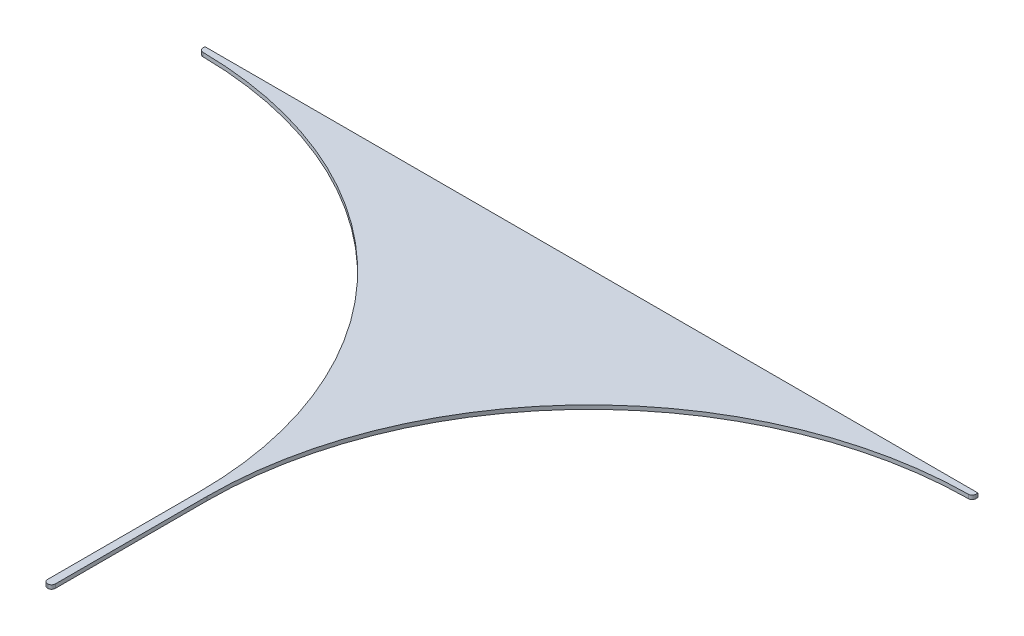
ISO-10303-21;
HEADER;
FILE_DESCRIPTION(('STEP AP214'),'2;1');
FILE_NAME('part.step','',(''),(''),'','','');
FILE_SCHEMA(('AUTOMOTIVE_DESIGN { 1 0 10303 214 1 1 1 1 }'));
ENDSEC;
DATA;
#1=APPLICATION_CONTEXT('core data for automotive mechanical design processes');
#2=APPLICATION_PROTOCOL_DEFINITION('international standard','automotive_design',2000,#1);
#3=PRODUCT_CONTEXT('',#1,'mechanical');
#4=PRODUCT('Part','Part','',(#3));
#5=PRODUCT_RELATED_PRODUCT_CATEGORY('part','',(#4));
#6=PRODUCT_DEFINITION_FORMATION('','',#4);
#7=PRODUCT_DEFINITION_CONTEXT('part definition',#1,'design');
#8=PRODUCT_DEFINITION('design','',#6,#7);
#9=PRODUCT_DEFINITION_SHAPE('','',#8);
#10=(LENGTH_UNIT() NAMED_UNIT(*) SI_UNIT(.MILLI.,.METRE.));
#11=(NAMED_UNIT(*) PLANE_ANGLE_UNIT() SI_UNIT($,.RADIAN.));
#12=(NAMED_UNIT(*) SI_UNIT($,.STERADIAN.) SOLID_ANGLE_UNIT());
#13=UNCERTAINTY_MEASURE_WITH_UNIT(LENGTH_MEASURE(1.E-05),#10,'distance_accuracy_value','');
#14=(GEOMETRIC_REPRESENTATION_CONTEXT(3) GLOBAL_UNCERTAINTY_ASSIGNED_CONTEXT((#13)) GLOBAL_UNIT_ASSIGNED_CONTEXT((#10,
#11,#12)) REPRESENTATION_CONTEXT('',''));
#15=CARTESIAN_POINT('',(0.,0.,0.));
#16=DIRECTION('',(0.,0.,1.));
#17=DIRECTION('',(1.,0.,0.));
#18=AXIS2_PLACEMENT_3D('',#15,#16,#17);
#19=CARTESIAN_POINT('',(0.,-2.,1.10907511904929));
#20=DIRECTION('',(-1.,0.,0.));
#21=DIRECTION('',(0.,0.,1.));
#22=AXIS2_PLACEMENT_3D('',#19,#20,#21);
#23=PLANE('',#22);
#24=DIRECTION('',(0.,0.,1.));
#25=VECTOR('',#24,1.);
#26=CARTESIAN_POINT('',(0.,0.,1.10907511904929));
#27=LINE('',#26,#25);
#28=CARTESIAN_POINT('',(0.,0.,0.));
#29=VERTEX_POINT('',#28);
#30=CARTESIAN_POINT('',(0.,0.,1.10907511904928));
#31=VERTEX_POINT('',#30);
#32=EDGE_CURVE('E157',#29,#31,#27,.T.);
#33=ORIENTED_EDGE('',*,*,#32,.F.);
#34=DIRECTION('',(0.,1.,0.));
#35=VECTOR('',#34,1.);
#36=CARTESIAN_POINT('',(0.,-2.,0.));
#37=LINE('',#36,#35);
#38=CARTESIAN_POINT('',(0.,-2.,0.));
#39=VERTEX_POINT('',#38);
#40=EDGE_CURVE('E11',#39,#29,#37,.T.);
#41=ORIENTED_EDGE('',*,*,#40,.F.);
#42=DIRECTION('',(0.,0.,1.));
#43=VECTOR('',#42,1.);
#44=CARTESIAN_POINT('',(0.,-2.,1.10907511904929));
#45=LINE('',#44,#43);
#46=CARTESIAN_POINT('',(0.,-2.,1.10907511904928));
#47=VERTEX_POINT('',#46);
#48=EDGE_CURVE('E189',#39,#47,#45,.T.);
#49=ORIENTED_EDGE('',*,*,#48,.T.);
#50=DIRECTION('',(0.,1.,0.));
#51=VECTOR('',#50,1.);
#52=CARTESIAN_POINT('',(0.,-2.,1.10907511904928));
#53=LINE('',#52,#51);
#54=EDGE_CURVE('E39',#47,#31,#53,.T.);
#55=ORIENTED_EDGE('',*,*,#54,.T.);
#56=EDGE_LOOP('',(#33,#41,#49,#55));
#57=FACE_BOUND('',#56,.T.);
#58=ADVANCED_FACE('F36',(#57),#23,.T.);
#59=CARTESIAN_POINT('',(0.,-2.,0.));
#60=DIRECTION('',(0.,0.,-1.));
#61=DIRECTION('',(-1.,0.,0.));
#62=AXIS2_PLACEMENT_3D('',#59,#60,#61);
#63=PLANE('',#62);
#64=DIRECTION('',(-1.,0.,0.));
#65=VECTOR('',#64,1.);
#66=CARTESIAN_POINT('',(0.,0.,0.));
#67=LINE('',#66,#65);
#68=CARTESIAN_POINT('',(398.,0.,0.));
#69=VERTEX_POINT('',#68);
#70=EDGE_CURVE('E187',#69,#29,#67,.T.);
#71=ORIENTED_EDGE('',*,*,#70,.F.);
#72=DIRECTION('',(0.,1.,0.));
#73=VECTOR('',#72,1.);
#74=CARTESIAN_POINT('',(398.,-2.,0.));
#75=LINE('',#74,#73);
#76=CARTESIAN_POINT('',(398.,-2.,0.));
#77=VERTEX_POINT('',#76);
#78=EDGE_CURVE('E45',#77,#69,#75,.T.);
#79=ORIENTED_EDGE('',*,*,#78,.F.);
#80=DIRECTION('',(-1.,0.,0.));
#81=VECTOR('',#80,1.);
#82=CARTESIAN_POINT('',(0.,-2.,0.));
#83=LINE('',#82,#81);
#84=EDGE_CURVE('E147',#77,#39,#83,.T.);
#85=ORIENTED_EDGE('',*,*,#84,.T.);
#86=ORIENTED_EDGE('',*,*,#40,.T.);
#87=EDGE_LOOP('',(#71,#79,#85,#86));
#88=FACE_BOUND('',#87,.T.);
#89=ADVANCED_FACE('F210',(#88),#63,.T.);
#90=CARTESIAN_POINT('',(398.,-2.,0.));
#91=DIRECTION('',(1.,0.,0.));
#92=DIRECTION('',(0.,0.,-1.));
#93=AXIS2_PLACEMENT_3D('',#90,#91,#92);
#94=PLANE('',#93);
#95=DIRECTION('',(0.,0.,-1.));
#96=VECTOR('',#95,1.);
#97=CARTESIAN_POINT('',(398.,0.,0.));
#98=LINE('',#97,#96);
#99=CARTESIAN_POINT('',(398.,0.,1.10907511904926));
#100=VERTEX_POINT('',#99);
#101=EDGE_CURVE('E134',#100,#69,#98,.T.);
#102=ORIENTED_EDGE('',*,*,#101,.F.);
#103=DIRECTION('',(0.,1.,0.));
#104=VECTOR('',#103,1.);
#105=CARTESIAN_POINT('',(398.,-2.,1.10907511904926));
#106=LINE('',#105,#104);
#107=CARTESIAN_POINT('',(398.,-2.,1.10907511904926));
#108=VERTEX_POINT('',#107);
#109=EDGE_CURVE('E129',#108,#100,#106,.T.);
#110=ORIENTED_EDGE('',*,*,#109,.F.);
#111=DIRECTION('',(0.,0.,-1.));
#112=VECTOR('',#111,1.);
#113=CARTESIAN_POINT('',(398.,-2.,0.));
#114=LINE('',#113,#112);
#115=EDGE_CURVE('E132',#108,#77,#114,.T.);
#116=ORIENTED_EDGE('',*,*,#115,.T.);
#117=ORIENTED_EDGE('',*,*,#78,.T.);
#118=EDGE_LOOP('',(#102,#110,#116,#117));
#119=FACE_BOUND('',#118,.T.);
#120=ADVANCED_FACE('F131',(#119),#94,.T.);
#121=CARTESIAN_POINT('',(396.1,-2.,1.10907511904926));
#122=DIRECTION('',(0.,1.,0.));
#123=DIRECTION('',(0.,0.,1.));
#124=AXIS2_PLACEMENT_3D('',#121,#122,#123);
#125=CYLINDRICAL_SURFACE('',#124,1.90000000000002);
#126=CARTESIAN_POINT('',(396.1,0.,1.10907511904926));
#127=DIRECTION('',(0.,1.,0.));
#128=DIRECTION('',(0.,0.,1.));
#129=AXIS2_PLACEMENT_3D('',#126,#127,#128);
#130=CIRCLE('',#129,1.90000000000002);
#131=CARTESIAN_POINT('',(396.118149824032,0.,3.00898842862095));
#132=VERTEX_POINT('',#131);
#133=EDGE_CURVE('E184',#132,#100,#130,.T.);
#134=ORIENTED_EDGE('',*,*,#133,.F.);
#135=DIRECTION('',(0.,1.,0.));
#136=VECTOR('',#135,1.);
#137=CARTESIAN_POINT('',(396.118149824032,-2.,3.00898842862095));
#138=LINE('',#137,#136);
#139=CARTESIAN_POINT('',(396.118149824032,-2.,3.00898842862095));
#140=VERTEX_POINT('',#139);
#141=EDGE_CURVE('E139',#140,#132,#138,.T.);
#142=ORIENTED_EDGE('',*,*,#141,.F.);
#143=CARTESIAN_POINT('',(396.1,-2.,1.10907511904926));
#144=DIRECTION('',(0.,1.,0.));
#145=DIRECTION('',(0.,0.,1.));
#146=AXIS2_PLACEMENT_3D('',#143,#144,#145);
#147=CIRCLE('',#146,1.90000000000002);
#148=EDGE_CURVE('E145',#140,#108,#147,.T.);
#149=ORIENTED_EDGE('',*,*,#148,.T.);
#150=ORIENTED_EDGE('',*,*,#109,.T.);
#151=EDGE_LOOP('',(#134,#142,#149,#150));
#152=FACE_BOUND('',#151,.T.);
#153=ADVANCED_FACE('F149',(#152),#125,.T.);
#154=CARTESIAN_POINT('',(398.,-2.,200.));
#155=DIRECTION('',(0.,1.,0.));
#156=DIRECTION('',(0.,0.,1.));
#157=AXIS2_PLACEMENT_3D('',#154,#155,#156);
#158=CYLINDRICAL_SURFACE('',#157,197.);
#159=CARTESIAN_POINT('',(398.,0.,200.));
#160=DIRECTION('',(0.,-1.,0.));
#161=DIRECTION('',(0.,0.,1.));
#162=AXIS2_PLACEMENT_3D('',#159,#160,#161);
#163=CIRCLE('',#162,197.);
#164=CARTESIAN_POINT('',(201.,0.,200.));
#165=VERTEX_POINT('',#164);
#166=EDGE_CURVE('E181',#165,#132,#163,.T.);
#167=ORIENTED_EDGE('',*,*,#166,.F.);
#168=DIRECTION('',(0.,1.,0.));
#169=VECTOR('',#168,1.);
#170=CARTESIAN_POINT('',(201.,-2.,200.));
#171=LINE('',#170,#169);
#172=CARTESIAN_POINT('',(201.,-2.,200.));
#173=VERTEX_POINT('',#172);
#174=EDGE_CURVE('E193',#173,#165,#171,.T.);
#175=ORIENTED_EDGE('',*,*,#174,.F.);
#176=CARTESIAN_POINT('',(398.,-2.,200.));
#177=DIRECTION('',(0.,-1.,0.));
#178=DIRECTION('',(0.,0.,1.));
#179=AXIS2_PLACEMENT_3D('',#176,#177,#178);
#180=CIRCLE('',#179,197.);
#181=EDGE_CURVE('E150',#173,#140,#180,.T.);
#182=ORIENTED_EDGE('',*,*,#181,.T.);
#183=ORIENTED_EDGE('',*,*,#141,.T.);
#184=EDGE_LOOP('',(#167,#175,#182,#183));
#185=FACE_BOUND('',#184,.T.);
#186=ADVANCED_FACE('F223',(#185),#158,.F.);
#187=CARTESIAN_POINT('',(201.,-2.,278.1));
#188=DIRECTION('',(1.,0.,0.));
#189=DIRECTION('',(0.,0.,-1.));
#190=AXIS2_PLACEMENT_3D('',#187,#188,#189);
#191=PLANE('',#190);
#192=DIRECTION('',(0.,0.,-1.));
#193=VECTOR('',#192,1.);
#194=CARTESIAN_POINT('',(201.,0.,278.1));
#195=LINE('',#194,#193);
#196=CARTESIAN_POINT('',(201.,0.,278.1));
#197=VERTEX_POINT('',#196);
#198=EDGE_CURVE('E178',#197,#165,#195,.T.);
#199=ORIENTED_EDGE('',*,*,#198,.F.);
#200=DIRECTION('',(0.,1.,0.));
#201=VECTOR('',#200,1.);
#202=CARTESIAN_POINT('',(201.,-2.,278.1));
#203=LINE('',#202,#201);
#204=CARTESIAN_POINT('',(201.,-2.,278.1));
#205=VERTEX_POINT('',#204);
#206=EDGE_CURVE('E195',#205,#197,#203,.T.);
#207=ORIENTED_EDGE('',*,*,#206,.F.);
#208=DIRECTION('',(0.,0.,-1.));
#209=VECTOR('',#208,1.);
#210=CARTESIAN_POINT('',(201.,-2.,278.1));
#211=LINE('',#210,#209);
#212=EDGE_CURVE('E152',#205,#173,#211,.T.);
#213=ORIENTED_EDGE('',*,*,#212,.T.);
#214=ORIENTED_EDGE('',*,*,#174,.T.);
#215=EDGE_LOOP('',(#199,#207,#213,#214));
#216=FACE_BOUND('',#215,.T.);
#217=ADVANCED_FACE('F226',(#216),#191,.T.);
#218=CARTESIAN_POINT('',(199.1,-2.,278.1));
#219=DIRECTION('',(0.,1.,0.));
#220=DIRECTION('',(0.,0.,1.));
#221=AXIS2_PLACEMENT_3D('',#218,#219,#220);
#222=CYLINDRICAL_SURFACE('',#221,1.90000000000001);
#223=CARTESIAN_POINT('',(199.1,0.,278.1));
#224=DIRECTION('',(0.,1.,0.));
#225=DIRECTION('',(0.,0.,1.));
#226=AXIS2_PLACEMENT_3D('',#223,#224,#225);
#227=CIRCLE('',#226,1.90000000000001);
#228=CARTESIAN_POINT('',(199.1,0.,280.));
#229=VERTEX_POINT('',#228);
#230=EDGE_CURVE('E175',#229,#197,#227,.T.);
#231=ORIENTED_EDGE('',*,*,#230,.F.);
#232=DIRECTION('',(0.,1.,0.));
#233=VECTOR('',#232,1.);
#234=CARTESIAN_POINT('',(199.1,-2.,280.));
#235=LINE('',#234,#233);
#236=CARTESIAN_POINT('',(199.1,-2.,280.));
#237=VERTEX_POINT('',#236);
#238=EDGE_CURVE('E197',#237,#229,#235,.T.);
#239=ORIENTED_EDGE('',*,*,#238,.F.);
#240=CARTESIAN_POINT('',(199.1,-2.,278.1));
#241=DIRECTION('',(0.,1.,0.));
#242=DIRECTION('',(0.,0.,1.));
#243=AXIS2_PLACEMENT_3D('',#240,#241,#242);
#244=CIRCLE('',#243,1.90000000000001);
#245=EDGE_CURVE('E382',#237,#205,#244,.T.);
#246=ORIENTED_EDGE('',*,*,#245,.T.);
#247=ORIENTED_EDGE('',*,*,#206,.T.);
#248=EDGE_LOOP('',(#231,#239,#246,#247));
#249=FACE_BOUND('',#248,.T.);
#250=ADVANCED_FACE('F230',(#249),#222,.T.);
#251=CARTESIAN_POINT('',(199.,-2.,280.));
#252=DIRECTION('',(0.,0.,1.));
#253=DIRECTION('',(1.,0.,0.));
#254=AXIS2_PLACEMENT_3D('',#251,#252,#253);
#255=PLANE('',#254);
#256=DIRECTION('',(1.,0.,0.));
#257=VECTOR('',#256,1.);
#258=CARTESIAN_POINT('',(199.,0.,280.));
#259=LINE('',#258,#257);
#260=CARTESIAN_POINT('',(198.9,0.,280.));
#261=VERTEX_POINT('',#260);
#262=EDGE_CURVE('E172',#261,#229,#259,.T.);
#263=ORIENTED_EDGE('',*,*,#262,.F.);
#264=DIRECTION('',(0.,1.,0.));
#265=VECTOR('',#264,1.);
#266=CARTESIAN_POINT('',(198.9,-2.,280.));
#267=LINE('',#266,#265);
#268=CARTESIAN_POINT('',(198.9,-2.,280.));
#269=VERTEX_POINT('',#268);
#270=EDGE_CURVE('E199',#269,#261,#267,.T.);
#271=ORIENTED_EDGE('',*,*,#270,.F.);
#272=DIRECTION('',(1.,0.,0.));
#273=VECTOR('',#272,1.);
#274=CARTESIAN_POINT('',(199.,-2.,280.));
#275=LINE('',#274,#273);
#276=EDGE_CURVE('E377',#269,#237,#275,.T.);
#277=ORIENTED_EDGE('',*,*,#276,.T.);
#278=ORIENTED_EDGE('',*,*,#238,.T.);
#279=EDGE_LOOP('',(#263,#271,#277,#278));
#280=FACE_BOUND('',#279,.T.);
#281=ADVANCED_FACE('F234',(#280),#255,.T.);
#282=CARTESIAN_POINT('',(198.9,-2.,278.1));
#283=DIRECTION('',(0.,1.,0.));
#284=DIRECTION('',(0.,0.,1.));
#285=AXIS2_PLACEMENT_3D('',#282,#283,#284);
#286=CYLINDRICAL_SURFACE('',#285,1.90000000000001);
#287=CARTESIAN_POINT('',(198.9,0.,278.1));
#288=DIRECTION('',(0.,1.,0.));
#289=DIRECTION('',(0.,0.,1.));
#290=AXIS2_PLACEMENT_3D('',#287,#288,#289);
#291=CIRCLE('',#290,1.90000000000001);
#292=CARTESIAN_POINT('',(197.,0.,278.1));
#293=VERTEX_POINT('',#292);
#294=EDGE_CURVE('E169',#293,#261,#291,.T.);
#295=ORIENTED_EDGE('',*,*,#294,.F.);
#296=DIRECTION('',(0.,1.,0.));
#297=VECTOR('',#296,1.);
#298=CARTESIAN_POINT('',(197.,-2.,278.1));
#299=LINE('',#298,#297);
#300=CARTESIAN_POINT('',(197.,-2.,278.1));
#301=VERTEX_POINT('',#300);
#302=EDGE_CURVE('E202',#301,#293,#299,.T.);
#303=ORIENTED_EDGE('',*,*,#302,.F.);
#304=CARTESIAN_POINT('',(198.9,-2.,278.1));
#305=DIRECTION('',(0.,1.,0.));
#306=DIRECTION('',(0.,0.,1.));
#307=AXIS2_PLACEMENT_3D('',#304,#305,#306);
#308=CIRCLE('',#307,1.90000000000001);
#309=EDGE_CURVE('E375',#301,#269,#308,.T.);
#310=ORIENTED_EDGE('',*,*,#309,.T.);
#311=ORIENTED_EDGE('',*,*,#270,.T.);
#312=EDGE_LOOP('',(#295,#303,#310,#311));
#313=FACE_BOUND('',#312,.T.);
#314=ADVANCED_FACE('F238',(#313),#286,.T.);
#315=CARTESIAN_POINT('',(197.,-2.,278.1));
#316=DIRECTION('',(-1.,0.,0.));
#317=DIRECTION('',(0.,0.,1.));
#318=AXIS2_PLACEMENT_3D('',#315,#316,#317);
#319=PLANE('',#318);
#320=DIRECTION('',(0.,0.,1.));
#321=VECTOR('',#320,1.);
#322=CARTESIAN_POINT('',(197.,0.,278.1));
#323=LINE('',#322,#321);
#324=CARTESIAN_POINT('',(197.,0.,200.));
#325=VERTEX_POINT('',#324);
#326=EDGE_CURVE('E166',#325,#293,#323,.T.);
#327=ORIENTED_EDGE('',*,*,#326,.F.);
#328=DIRECTION('',(0.,1.,0.));
#329=VECTOR('',#328,1.);
#330=CARTESIAN_POINT('',(197.,-2.,200.));
#331=LINE('',#330,#329);
#332=CARTESIAN_POINT('',(197.,-2.,200.));
#333=VERTEX_POINT('',#332);
#334=EDGE_CURVE('E204',#333,#325,#331,.T.);
#335=ORIENTED_EDGE('',*,*,#334,.F.);
#336=DIRECTION('',(0.,0.,1.));
#337=VECTOR('',#336,1.);
#338=CARTESIAN_POINT('',(197.,-2.,278.1));
#339=LINE('',#338,#337);
#340=EDGE_CURVE('E372',#333,#301,#339,.T.);
#341=ORIENTED_EDGE('',*,*,#340,.T.);
#342=ORIENTED_EDGE('',*,*,#302,.T.);
#343=EDGE_LOOP('',(#327,#335,#341,#342));
#344=FACE_BOUND('',#343,.T.);
#345=ADVANCED_FACE('F242',(#344),#319,.T.);
#346=CARTESIAN_POINT('',(0.,-2.,200.));
#347=DIRECTION('',(0.,1.,0.));
#348=DIRECTION('',(0.,0.,1.));
#349=AXIS2_PLACEMENT_3D('',#346,#347,#348);
#350=CYLINDRICAL_SURFACE('',#349,197.);
#351=CARTESIAN_POINT('',(0.,0.,200.));
#352=DIRECTION('',(0.,-1.,0.));
#353=DIRECTION('',(0.,0.,1.));
#354=AXIS2_PLACEMENT_3D('',#351,#352,#353);
#355=CIRCLE('',#354,197.);
#356=CARTESIAN_POINT('',(1.88185017596787,0.,3.00898842862093));
#357=VERTEX_POINT('',#356);
#358=EDGE_CURVE('E163',#357,#325,#355,.T.);
#359=ORIENTED_EDGE('',*,*,#358,.F.);
#360=DIRECTION('',(0.,1.,0.));
#361=VECTOR('',#360,1.);
#362=CARTESIAN_POINT('',(1.88185017596787,-2.,3.00898842862093));
#363=LINE('',#362,#361);
#364=CARTESIAN_POINT('',(1.88185017596787,-2.,3.00898842862093));
#365=VERTEX_POINT('',#364);
#366=EDGE_CURVE('E205',#365,#357,#363,.T.);
#367=ORIENTED_EDGE('',*,*,#366,.F.);
#368=CARTESIAN_POINT('',(0.,-2.,200.));
#369=DIRECTION('',(0.,-1.,0.));
#370=DIRECTION('',(0.,0.,1.));
#371=AXIS2_PLACEMENT_3D('',#368,#369,#370);
#372=CIRCLE('',#371,197.);
#373=EDGE_CURVE('E392',#365,#333,#372,.T.);
#374=ORIENTED_EDGE('',*,*,#373,.T.);
#375=ORIENTED_EDGE('',*,*,#334,.T.);
#376=EDGE_LOOP('',(#359,#367,#374,#375));
#377=FACE_BOUND('',#376,.T.);
#378=ADVANCED_FACE('F246',(#377),#350,.F.);
#379=CARTESIAN_POINT('',(1.90000000000001,-2.,1.10907511904927));
#380=DIRECTION('',(0.,1.,0.));
#381=DIRECTION('',(0.,0.,1.));
#382=AXIS2_PLACEMENT_3D('',#379,#380,#381);
#383=CYLINDRICAL_SURFACE('',#382,1.9);
#384=CARTESIAN_POINT('',(1.90000000000001,0.,1.10907511904927));
#385=DIRECTION('',(0.,1.,0.));
#386=DIRECTION('',(0.,0.,1.));
#387=AXIS2_PLACEMENT_3D('',#384,#385,#386);
#388=CIRCLE('',#387,1.9);
#389=EDGE_CURVE('E160',#31,#357,#388,.T.);
#390=ORIENTED_EDGE('',*,*,#389,.F.);
#391=ORIENTED_EDGE('',*,*,#54,.F.);
#392=CARTESIAN_POINT('',(1.90000000000001,-2.,1.10907511904927));
#393=DIRECTION('',(0.,1.,0.));
#394=DIRECTION('',(0.,0.,1.));
#395=AXIS2_PLACEMENT_3D('',#392,#393,#394);
#396=CIRCLE('',#395,1.9);
#397=EDGE_CURVE('E394',#47,#365,#396,.T.);
#398=ORIENTED_EDGE('',*,*,#397,.T.);
#399=ORIENTED_EDGE('',*,*,#366,.T.);
#400=EDGE_LOOP('',(#390,#391,#398,#399));
#401=FACE_BOUND('',#400,.T.);
#402=ADVANCED_FACE('F207',(#401),#383,.T.);
#403=CARTESIAN_POINT('',(396.1,-2.,1.10907511904926));
#404=DIRECTION('',(0.,1.,0.));
#405=DIRECTION('',(0.,0.,1.));
#406=AXIS2_PLACEMENT_3D('',#403,#404,#405);
#407=PLANE('',#406);
#408=ORIENTED_EDGE('',*,*,#48,.F.);
#409=ORIENTED_EDGE('',*,*,#84,.F.);
#410=ORIENTED_EDGE('',*,*,#115,.F.);
#411=ORIENTED_EDGE('',*,*,#148,.F.);
#412=ORIENTED_EDGE('',*,*,#181,.F.);
#413=ORIENTED_EDGE('',*,*,#212,.F.);
#414=ORIENTED_EDGE('',*,*,#245,.F.);
#415=ORIENTED_EDGE('',*,*,#276,.F.);
#416=ORIENTED_EDGE('',*,*,#309,.F.);
#417=ORIENTED_EDGE('',*,*,#340,.F.);
#418=ORIENTED_EDGE('',*,*,#373,.F.);
#419=ORIENTED_EDGE('',*,*,#397,.F.);
#420=EDGE_LOOP('',(#408,#409,#410,#411,#412,#413,#414,#415,#416,#417,#418,#419));
#421=FACE_BOUND('',#420,.T.);
#422=ADVANCED_FACE('F143',(#421),#407,.F.);
#423=CARTESIAN_POINT('',(396.1,0.,1.10907511904926));
#424=DIRECTION('',(0.,1.,0.));
#425=DIRECTION('',(0.,0.,1.));
#426=AXIS2_PLACEMENT_3D('',#423,#424,#425);
#427=PLANE('',#426);
#428=ORIENTED_EDGE('',*,*,#32,.T.);
#429=ORIENTED_EDGE('',*,*,#389,.T.);
#430=ORIENTED_EDGE('',*,*,#358,.T.);
#431=ORIENTED_EDGE('',*,*,#326,.T.);
#432=ORIENTED_EDGE('',*,*,#294,.T.);
#433=ORIENTED_EDGE('',*,*,#262,.T.);
#434=ORIENTED_EDGE('',*,*,#230,.T.);
#435=ORIENTED_EDGE('',*,*,#198,.T.);
#436=ORIENTED_EDGE('',*,*,#166,.T.);
#437=ORIENTED_EDGE('',*,*,#133,.T.);
#438=ORIENTED_EDGE('',*,*,#101,.T.);
#439=ORIENTED_EDGE('',*,*,#70,.T.);
#440=EDGE_LOOP('',(#428,#429,#430,#431,#432,#433,#434,#435,#436,#437,#438,#439));
#441=FACE_BOUND('',#440,.T.);
#442=ADVANCED_FACE('F209',(#441),#427,.T.);
#443=CLOSED_SHELL('',(#58,#89,#120,#153,#186,#217,#250,#281,#314,#345,#378,#402,#422,#442));
#444=MANIFOLD_SOLID_BREP('B2',#443);
#445=ADVANCED_BREP_SHAPE_REPRESENTATION('',(#18,#444),#14);
#446=SHAPE_DEFINITION_REPRESENTATION(#9,#445);
ENDSEC;
END-ISO-10303-21;
